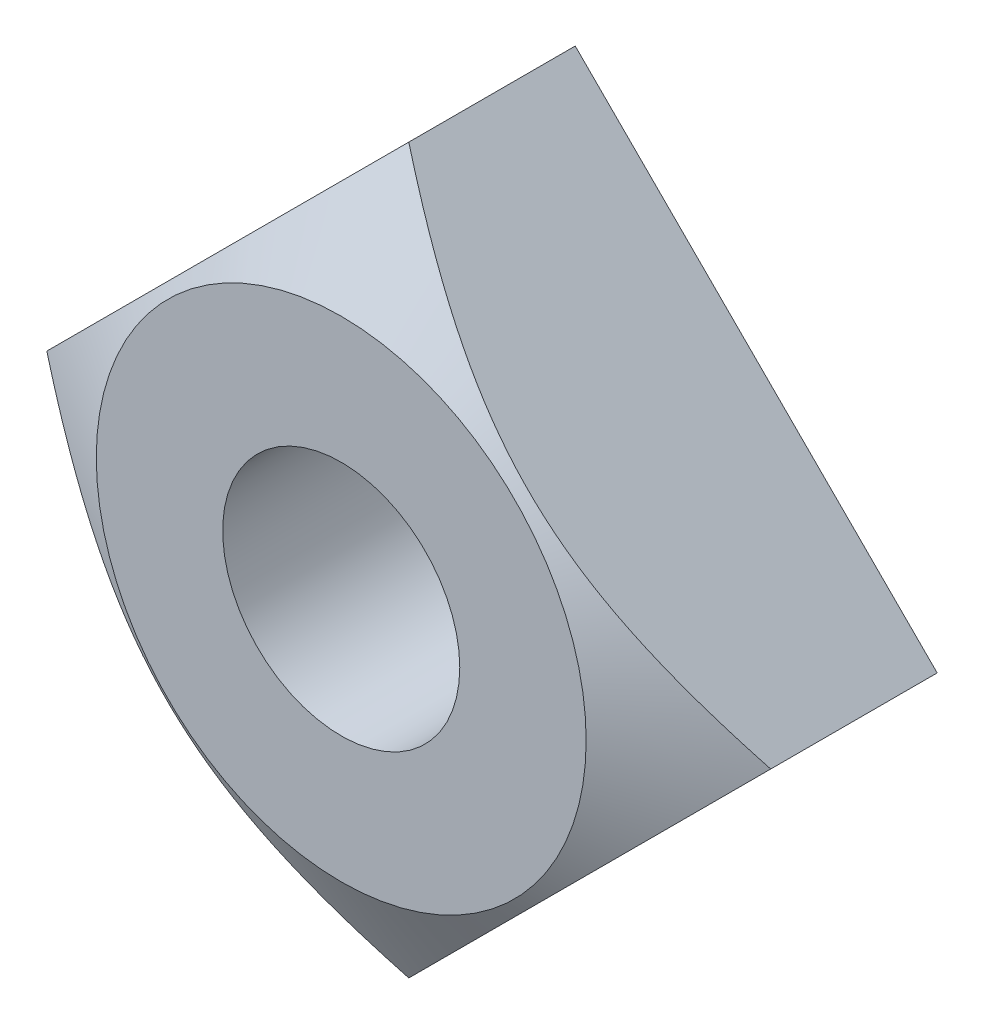
ISO-10303-21;
HEADER;
FILE_DESCRIPTION(('STEP AP214'),'2;1');
FILE_NAME('part.step','',(''),(''),'','','');
FILE_SCHEMA(('AUTOMOTIVE_DESIGN { 1 0 10303 214 1 1 1 1 }'));
ENDSEC;
DATA;
#1=APPLICATION_CONTEXT('core data for automotive mechanical design processes');
#2=APPLICATION_PROTOCOL_DEFINITION('international standard','automotive_design',2000,#1);
#3=PRODUCT_CONTEXT('',#1,'mechanical');
#4=PRODUCT('Part','Part','',(#3));
#5=PRODUCT_RELATED_PRODUCT_CATEGORY('part','',(#4));
#6=PRODUCT_DEFINITION_FORMATION('','',#4);
#7=PRODUCT_DEFINITION_CONTEXT('part definition',#1,'design');
#8=PRODUCT_DEFINITION('design','',#6,#7);
#9=PRODUCT_DEFINITION_SHAPE('','',#8);
#10=(LENGTH_UNIT() NAMED_UNIT(*) SI_UNIT(.MILLI.,.METRE.));
#11=(NAMED_UNIT(*) PLANE_ANGLE_UNIT() SI_UNIT($,.RADIAN.));
#12=(NAMED_UNIT(*) SI_UNIT($,.STERADIAN.) SOLID_ANGLE_UNIT());
#13=UNCERTAINTY_MEASURE_WITH_UNIT(LENGTH_MEASURE(1.E-05),#10,'distance_accuracy_value','');
#14=(GEOMETRIC_REPRESENTATION_CONTEXT(3) GLOBAL_UNCERTAINTY_ASSIGNED_CONTEXT((#13)) GLOBAL_UNIT_ASSIGNED_CONTEXT((#10,
#11,#12)) REPRESENTATION_CONTEXT('',''));
#15=CARTESIAN_POINT('',(0.,0.,0.));
#16=DIRECTION('',(0.,0.,1.));
#17=DIRECTION('',(1.,0.,0.));
#18=AXIS2_PLACEMENT_3D('',#15,#16,#17);
#19=CARTESIAN_POINT('',(-4.94974746830584,0.,-3.2));
#20=DIRECTION('',(-0.707106781186546,-0.707106781186549,0.));
#21=DIRECTION('',(0.707106781186549,-0.707106781186546,0.));
#22=AXIS2_PLACEMENT_3D('',#19,#20,#21);
#23=PLANE('',#22);
#24=DIRECTION('',(0.,0.,1.));
#25=VECTOR('',#24,1.);
#26=CARTESIAN_POINT('',(0.,-4.94974746830582,-3.2));
#27=LINE('',#26,#25);
#28=CARTESIAN_POINT('',(0.,-4.94974746830582,-3.2));
#29=VERTEX_POINT('',#28);
#30=CARTESIAN_POINT('',(0.,-4.94974746830582,-0.923760430703405));
#31=VERTEX_POINT('',#30);
#32=EDGE_CURVE('E41',#29,#31,#27,.T.);
#33=ORIENTED_EDGE('',*,*,#32,.T.);
#34=CARTESIAN_POINT('',(0.000199999999999179,-4.94994746830582,-0.923875903089995));
#35=CARTESIAN_POINT('',(-0.0839601660028808,-4.86578730230294,-0.875301700684418));
#36=CARTESIAN_POINT('',(-0.168424419906984,-4.78132304839884,-0.827756769447801));
#37=CARTESIAN_POINT('',(-0.338079689757784,-4.61166777854804,-0.73521253325769));
#38=CARTESIAN_POINT('',(-0.423270948006075,-4.52647652029975,-0.690214118462973));
#39=CARTESIAN_POINT('',(-0.594968462234951,-4.35477900607087,-0.603016299925455));
#40=CARTESIAN_POINT('',(-0.681479588449488,-4.26826787985634,-0.560835877028449));
#41=CARTESIAN_POINT('',(-0.855358878652713,-4.09438858965311,-0.480244658262813));
#42=CARTESIAN_POINT('',(-0.942726969304584,-4.00702049900124,-0.441833542869514));
#43=CARTESIAN_POINT('',(-1.20330061446436,-3.74644685384146,-0.334596357966231));
#44=CARTESIAN_POINT('',(-1.37791598238263,-3.57183148592319,-0.272223037278309));
#45=CARTESIAN_POINT('',(-1.64222911972484,-3.30751834858099,-0.19698577814739));
#46=CARTESIAN_POINT('',(-1.73063793841792,-3.21910952988791,-0.174973987250971));
#47=CARTESIAN_POINT('',(-1.90818482696287,-3.04156264134296,-0.137862086448636));
#48=CARTESIAN_POINT('',(-1.99732281697572,-2.95242465133011,-0.122761229888339));
#49=CARTESIAN_POINT('',(-2.16148855844019,-2.78825890986564,-0.101990357616201));
#50=CARTESIAN_POINT('',(-2.2364447516216,-2.71330271668424,-0.0951833604501962));
#51=CARTESIAN_POINT('',(-2.38650648576161,-2.56324098254422,-0.0871121078921697));
#52=CARTESIAN_POINT('',(-2.46161202165303,-2.48813544665281,-0.0858476675465542));
#53=CARTESIAN_POINT('',(-2.61179942215488,-2.33794804615095,-0.0889101420700603));
#54=CARTESIAN_POINT('',(-2.68688126145778,-2.26286620684805,-0.0932395392237168));
#55=CARTESIAN_POINT('',(-2.83678422284844,-2.11296324545739,-0.107333399766151));
#56=CARTESIAN_POINT('',(-2.91160534019332,-2.03814212811252,-0.117097961514012));
#57=CARTESIAN_POINT('',(-3.13567456319269,-1.81407290511314,-0.15413062636452));
#58=CARTESIAN_POINT('',(-3.28430015054405,-1.66544731776178,-0.189131487418882));
#59=CARTESIAN_POINT('',(-3.5790206770755,-1.37072679123034,-0.275869415362278));
#60=CARTESIAN_POINT('',(-3.72511502076127,-1.22463244754457,-0.327610365638892));
#61=CARTESIAN_POINT('',(-3.96203126397509,-0.987716204330746,-0.422603609169501));
#62=CARTESIAN_POINT('',(-4.05362686764023,-0.896120600665609,-0.462096846697825));
#63=CARTESIAN_POINT('',(-4.23582321894716,-0.713924249358685,-0.545301855299965));
#64=CARTESIAN_POINT('',(-4.32642425639997,-0.623323211905875,-0.589012359074477));
#65=CARTESIAN_POINT('',(-4.50628300957973,-0.44346445872611,-0.679657577017405));
#66=CARTESIAN_POINT('',(-4.59554524176978,-0.354202226536065,-0.726574515335598));
#67=CARTESIAN_POINT('',(-4.77329907020979,-0.176448398096054,-0.823244540275509));
#68=CARTESIAN_POINT('',(-4.86179067498948,-0.0879567933163678,-0.87299759545944));
#69=CARTESIAN_POINT('',(-4.94994746830582,0.000199999999975448,-0.923875903089995));
#70=B_SPLINE_CURVE_WITH_KNOTS('',3,(#34,#35,#36,#37,#38,#39,#40,#41,#42,#43,#44,#45,#46,#47,#48,
#49,#50,#51,#52,#53,#54,#55,#56,#57,#58,#59,#60,#61,#62,#63,#64,#65,#66,#67,#68,#69),
.UNSPECIFIED.,.F.,.F.,(4,2,2,2,2,2,2,2,2,2,2,2,2,2,2,2,2,4),(0.,0.385660384227343,
0.771454757365617,1.15962924110927,1.54777079077608,2.3107687144879,2.69147048630605,
3.0721311175526,3.39066217819685,3.70918260946644,4.02784443382364,4.34651202512738,
4.98481192887893,5.62326001256813,6.02945619494842,6.43553069227648,6.83951259586986,
7.24349002227529),.UNSPECIFIED.);
#71=CARTESIAN_POINT('',(-4.94974746830582,0.,-0.923760430703405));
#72=VERTEX_POINT('',#71);
#73=EDGE_CURVE('E54',#31,#72,#70,.T.);
#74=ORIENTED_EDGE('',*,*,#73,.T.);
#75=DIRECTION('',(0.,0.,1.));
#76=VECTOR('',#75,1.);
#77=CARTESIAN_POINT('',(-4.94974746830584,0.,-3.2));
#78=LINE('',#77,#76);
#79=CARTESIAN_POINT('',(-4.94974746830584,0.,-3.2));
#80=VERTEX_POINT('',#79);
#81=EDGE_CURVE('E11',#80,#72,#78,.T.);
#82=ORIENTED_EDGE('',*,*,#81,.F.);
#83=DIRECTION('',(0.707106781186549,-0.707106781186546,0.));
#84=VECTOR('',#83,1.);
#85=CARTESIAN_POINT('',(-4.94974746830584,0.,-3.2));
#86=LINE('',#85,#84);
#87=EDGE_CURVE('E107',#80,#29,#86,.T.);
#88=ORIENTED_EDGE('',*,*,#87,.T.);
#89=EDGE_LOOP('',(#33,#74,#82,#88));
#90=FACE_BOUND('',#89,.T.);
#91=ADVANCED_FACE('F37',(#90),#23,.T.);
#92=CARTESIAN_POINT('',(-4.94974746830584,0.,-3.2));
#93=DIRECTION('',(-0.707106781186546,0.707106781186549,0.));
#94=DIRECTION('',(-0.707106781186549,-0.707106781186546,0.));
#95=AXIS2_PLACEMENT_3D('',#92,#93,#94);
#96=PLANE('',#95);
#97=ORIENTED_EDGE('',*,*,#81,.T.);
#98=CARTESIAN_POINT('',(-4.94994746830582,-0.000199999999978556,-0.923875903089996));
#99=CARTESIAN_POINT('',(-4.86578730230294,0.0839601660029008,-0.875301700684419));
#100=CARTESIAN_POINT('',(-4.78132304839884,0.168424419907004,-0.827756769447802));
#101=CARTESIAN_POINT('',(-4.61166777854804,0.338079689757803,-0.73521253325769));
#102=CARTESIAN_POINT('',(-4.52647652029975,0.423270948006094,-0.690214118462972));
#103=CARTESIAN_POINT('',(-4.35477900607087,0.594968462234969,-0.603016299925455));
#104=CARTESIAN_POINT('',(-4.26826787985633,0.681479588449506,-0.560835877028449));
#105=CARTESIAN_POINT('',(-4.09438858965311,0.85535887865273,-0.480244658262813));
#106=CARTESIAN_POINT('',(-4.00702049900124,0.9427269693046,-0.441833542869514));
#107=CARTESIAN_POINT('',(-3.74644685384146,1.20330061446438,-0.334596357966231));
#108=CARTESIAN_POINT('',(-3.57183148592319,1.37791598238265,-0.272223037278309));
#109=CARTESIAN_POINT('',(-3.30751834858098,1.64222911972486,-0.196985778147389));
#110=CARTESIAN_POINT('',(-3.21910952988791,1.73063793841793,-0.174973987250971));
#111=CARTESIAN_POINT('',(-3.04156264134295,1.90818482696288,-0.137862086448636));
#112=CARTESIAN_POINT('',(-2.95242465133011,1.99732281697573,-0.122761229888339));
#113=CARTESIAN_POINT('',(-2.78825890986563,2.1614885584402,-0.101990357616201));
#114=CARTESIAN_POINT('',(-2.71330271668423,2.23644475162161,-0.0951833604501964));
#115=CARTESIAN_POINT('',(-2.56324098254421,2.38650648576162,-0.0871121078921698));
#116=CARTESIAN_POINT('',(-2.4881354466528,2.46161202165304,-0.0858476675465542));
#117=CARTESIAN_POINT('',(-2.33794804615094,2.61179942215489,-0.0889101420700601));
#118=CARTESIAN_POINT('',(-2.26286620684804,2.68688126145779,-0.0932395392237165));
#119=CARTESIAN_POINT('',(-2.11296324545738,2.83678422284845,-0.107333399766151));
#120=CARTESIAN_POINT('',(-2.03814212811251,2.91160534019332,-0.117097961514012));
#121=CARTESIAN_POINT('',(-1.81407290511313,3.1356745631927,-0.15413062636452));
#122=CARTESIAN_POINT('',(-1.66544731776177,3.28430015054406,-0.189131487418882));
#123=CARTESIAN_POINT('',(-1.37072679123033,3.5790206770755,-0.275869415362277));
#124=CARTESIAN_POINT('',(-1.22463244754456,3.72511502076127,-0.327610365638891));
#125=CARTESIAN_POINT('',(-0.987716204330729,3.9620312639751,-0.4226036091695));
#126=CARTESIAN_POINT('',(-0.896120600665592,4.05362686764023,-0.462096846697825));
#127=CARTESIAN_POINT('',(-0.713924249358667,4.23582321894716,-0.545301855299965));
#128=CARTESIAN_POINT('',(-0.623323211905855,4.32642425639997,-0.589012359074476));
#129=CARTESIAN_POINT('',(-0.443464458726088,4.50628300957974,-0.679657577017405));
#130=CARTESIAN_POINT('',(-0.354202226536043,4.59554524176978,-0.726574515335599));
#131=CARTESIAN_POINT('',(-0.176448398096032,4.77329907020979,-0.82324454027551));
#132=CARTESIAN_POINT('',(-0.0879567933163446,4.86179067498948,-0.872997595459441));
#133=CARTESIAN_POINT('',(0.000199999999999686,4.94994746830582,-0.923875903089996));
#134=B_SPLINE_CURVE_WITH_KNOTS('',3,(#98,#99,#100,#101,#102,#103,#104,#105,#106,#107,#108,#109,
#110,#111,#112,#113,#114,#115,#116,#117,#118,#119,#120,#121,#122,#123,#124,#125,#126,#127,#128,
#129,#130,#131,#132,#133),.UNSPECIFIED.,.F.,.F.,(4,2,2,2,2,2,2,2,2,2,2,2,2,2,2,2,2,4),(0.,
0.385660384227344,0.771454757365618,1.15962924110927,1.54777079077608,2.3107687144879,
2.69147048630605,3.0721311175526,3.39066217819685,3.70918260946645,4.02784443382364,
4.34651202512738,4.98481192887893,5.62326001256813,6.02945619494842,6.43553069227649,
6.83951259586986,7.24349002227529),.UNSPECIFIED.);
#135=CARTESIAN_POINT('',(0.,4.94974746830582,-0.923760430703405));
#136=VERTEX_POINT('',#135);
#137=EDGE_CURVE('E93',#72,#136,#134,.T.);
#138=ORIENTED_EDGE('',*,*,#137,.T.);
#139=DIRECTION('',(0.,0.,1.));
#140=VECTOR('',#139,1.);
#141=CARTESIAN_POINT('',(0.,4.94974746830582,-3.2));
#142=LINE('',#141,#140);
#143=CARTESIAN_POINT('',(0.,4.94974746830582,-3.2));
#144=VERTEX_POINT('',#143);
#145=EDGE_CURVE('E46',#144,#136,#142,.T.);
#146=ORIENTED_EDGE('',*,*,#145,.F.);
#147=DIRECTION('',(-0.707106781186549,-0.707106781186546,0.));
#148=VECTOR('',#147,1.);
#149=CARTESIAN_POINT('',(-4.94974746830584,0.,-3.2));
#150=LINE('',#149,#148);
#151=EDGE_CURVE('E100',#144,#80,#150,.T.);
#152=ORIENTED_EDGE('',*,*,#151,.T.);
#153=EDGE_LOOP('',(#97,#138,#146,#152));
#154=FACE_BOUND('',#153,.T.);
#155=ADVANCED_FACE('F146',(#154),#96,.T.);
#156=CARTESIAN_POINT('',(4.94974746830584,0.,-3.2));
#157=DIRECTION('',(0.707106781186546,0.707106781186549,0.));
#158=DIRECTION('',(-0.707106781186549,0.707106781186546,0.));
#159=AXIS2_PLACEMENT_3D('',#156,#157,#158);
#160=PLANE('',#159);
#161=ORIENTED_EDGE('',*,*,#145,.T.);
#162=CARTESIAN_POINT('',(-0.000200000000000852,4.94994746830582,-0.923875903089995));
#163=CARTESIAN_POINT('',(0.0839601660028781,4.86578730230294,-0.875301700684418));
#164=CARTESIAN_POINT('',(0.168424419906982,4.78132304839884,-0.827756769447801));
#165=CARTESIAN_POINT('',(0.338079689757783,4.61166777854804,-0.735212533257689));
#166=CARTESIAN_POINT('',(0.423270948006074,4.52647652029975,-0.690214118462972));
#167=CARTESIAN_POINT('',(0.59496846223495,4.35477900607087,-0.603016299925455));
#168=CARTESIAN_POINT('',(0.681479588449486,4.26826787985634,-0.560835877028449));
#169=CARTESIAN_POINT('',(0.85535887865271,4.09438858965311,-0.480244658262813));
#170=CARTESIAN_POINT('',(0.942726969304582,4.00702049900124,-0.441833542869513));
#171=CARTESIAN_POINT('',(1.20330061446436,3.74644685384146,-0.334596357966231));
#172=CARTESIAN_POINT('',(1.37791598238263,3.57183148592319,-0.272223037278309));
#173=CARTESIAN_POINT('',(1.64222911972484,3.30751834858099,-0.196985778147389));
#174=CARTESIAN_POINT('',(1.73063793841791,3.21910952988791,-0.174973987250971));
#175=CARTESIAN_POINT('',(1.90818482696287,3.04156264134296,-0.137862086448636));
#176=CARTESIAN_POINT('',(1.99732281697572,2.95242465133011,-0.122761229888339));
#177=CARTESIAN_POINT('',(2.16148855844019,2.78825890986564,-0.101990357616201));
#178=CARTESIAN_POINT('',(2.23644475162159,2.71330271668424,-0.0951833604501959));
#179=CARTESIAN_POINT('',(2.38650648576161,2.56324098254422,-0.0871121078921692));
#180=CARTESIAN_POINT('',(2.46161202165302,2.48813544665281,-0.0858476675465535));
#181=CARTESIAN_POINT('',(2.61179942215488,2.33794804615095,-0.0889101420700595));
#182=CARTESIAN_POINT('',(2.68688126145778,2.26286620684805,-0.0932395392237159));
#183=CARTESIAN_POINT('',(2.83678422284844,2.11296324545739,-0.10733339976615));
#184=CARTESIAN_POINT('',(2.91160534019331,2.03814212811252,-0.117097961514011));
#185=CARTESIAN_POINT('',(3.13567456319269,1.81407290511315,-0.154130626364519));
#186=CARTESIAN_POINT('',(3.28430015054405,1.66544731776178,-0.189131487418881));
#187=CARTESIAN_POINT('',(3.57902067707549,1.37072679123034,-0.275869415362276));
#188=CARTESIAN_POINT('',(3.72511502076127,1.22463244754457,-0.327610365638891));
#189=CARTESIAN_POINT('',(3.96203126397509,0.987716204330747,-0.422603609169499));
#190=CARTESIAN_POINT('',(4.05362686764023,0.89612060066561,-0.462096846697824));
#191=CARTESIAN_POINT('',(4.23582321894715,0.713924249358685,-0.545301855299964));
#192=CARTESIAN_POINT('',(4.32642425639997,0.623323211905875,-0.589012359074475));
#193=CARTESIAN_POINT('',(4.50628300957973,0.443464458726109,-0.679657577017404));
#194=CARTESIAN_POINT('',(4.59554524176978,0.354202226536064,-0.726574515335598));
#195=CARTESIAN_POINT('',(4.77329907020979,0.176448398096053,-0.823244540275509));
#196=CARTESIAN_POINT('',(4.86179067498948,0.0879567933163666,-0.872997595459441));
#197=CARTESIAN_POINT('',(4.94994746830582,-0.000199999999976861,-0.923875903089995));
#198=B_SPLINE_CURVE_WITH_KNOTS('',3,(#162,#163,#164,#165,#166,#167,#168,#169,#170,#171,#172,
#173,#174,#175,#176,#177,#178,#179,#180,#181,#182,#183,#184,#185,#186,#187,#188,#189,#190,#191,
#192,#193,#194,#195,#196,#197),.UNSPECIFIED.,.F.,.F.,(4,2,2,2,2,2,2,2,2,2,2,2,2,2,2,2,2,4),(0.,
0.385660384227344,0.771454757365618,1.15962924110927,1.54777079077608,2.3107687144879,
2.69147048630605,3.0721311175526,3.39066217819685,3.70918260946644,4.02784443382363,
4.34651202512738,4.98481192887893,5.62326001256813,6.02945619494842,6.43553069227649,
6.83951259586986,7.24349002227529),.UNSPECIFIED.);
#199=CARTESIAN_POINT('',(4.94974746830582,0.,-0.923760430703405));
#200=VERTEX_POINT('',#199);
#201=EDGE_CURVE('E80',#136,#200,#198,.T.);
#202=ORIENTED_EDGE('',*,*,#201,.T.);
#203=DIRECTION('',(0.,0.,1.));
#204=VECTOR('',#203,1.);
#205=CARTESIAN_POINT('',(4.94974746830584,0.,-3.2));
#206=LINE('',#205,#204);
#207=CARTESIAN_POINT('',(4.94974746830584,0.,-3.2));
#208=VERTEX_POINT('',#207);
#209=EDGE_CURVE('E91',#208,#200,#206,.T.);
#210=ORIENTED_EDGE('',*,*,#209,.F.);
#211=DIRECTION('',(-0.707106781186549,0.707106781186546,0.));
#212=VECTOR('',#211,1.);
#213=CARTESIAN_POINT('',(4.94974746830584,0.,-3.2));
#214=LINE('',#213,#212);
#215=EDGE_CURVE('E104',#208,#144,#214,.T.);
#216=ORIENTED_EDGE('',*,*,#215,.T.);
#217=EDGE_LOOP('',(#161,#202,#210,#216));
#218=FACE_BOUND('',#217,.T.);
#219=ADVANCED_FACE('F89',(#218),#160,.T.);
#220=CARTESIAN_POINT('',(4.94974746830584,0.,-3.2));
#221=DIRECTION('',(0.707106781186546,-0.707106781186549,0.));
#222=DIRECTION('',(0.707106781186549,0.707106781186546,0.));
#223=AXIS2_PLACEMENT_3D('',#220,#221,#222);
#224=PLANE('',#223);
#225=ORIENTED_EDGE('',*,*,#209,.T.);
#226=CARTESIAN_POINT('',(4.94994746830582,0.000199999999977127,-0.923875903089996));
#227=CARTESIAN_POINT('',(4.86578730230294,-0.0839601660029019,-0.875301700684419));
#228=CARTESIAN_POINT('',(4.78132304839884,-0.168424419907005,-0.827756769447802));
#229=CARTESIAN_POINT('',(4.61166777854804,-0.338079689757805,-0.73521253325769));
#230=CARTESIAN_POINT('',(4.52647652029975,-0.423270948006095,-0.690214118462972));
#231=CARTESIAN_POINT('',(4.35477900607087,-0.59496846223497,-0.603016299925455));
#232=CARTESIAN_POINT('',(4.26826787985633,-0.681479588449506,-0.560835877028449));
#233=CARTESIAN_POINT('',(4.09438858965311,-0.85535887865273,-0.480244658262813));
#234=CARTESIAN_POINT('',(4.00702049900124,-0.942726969304601,-0.441833542869514));
#235=CARTESIAN_POINT('',(3.74644685384146,-1.20330061446438,-0.334596357966231));
#236=CARTESIAN_POINT('',(3.57183148592319,-1.37791598238265,-0.272223037278309));
#237=CARTESIAN_POINT('',(3.30751834858098,-1.64222911972486,-0.196985778147389));
#238=CARTESIAN_POINT('',(3.21910952988791,-1.73063793841793,-0.174973987250971));
#239=CARTESIAN_POINT('',(3.04156264134295,-1.90818482696288,-0.137862086448636));
#240=CARTESIAN_POINT('',(2.9524246513301,-1.99732281697573,-0.122761229888339));
#241=CARTESIAN_POINT('',(2.78825890986563,-2.1614885584402,-0.101990357616201));
#242=CARTESIAN_POINT('',(2.71330271668423,-2.23644475162161,-0.0951833604501961));
#243=CARTESIAN_POINT('',(2.56324098254421,-2.38650648576162,-0.0871121078921693));
#244=CARTESIAN_POINT('',(2.4881354466528,-2.46161202165304,-0.0858476675465534));
#245=CARTESIAN_POINT('',(2.33794804615094,-2.61179942215489,-0.0889101420700593));
#246=CARTESIAN_POINT('',(2.26286620684804,-2.68688126145779,-0.0932395392237158));
#247=CARTESIAN_POINT('',(2.11296324545738,-2.83678422284845,-0.10733339976615));
#248=CARTESIAN_POINT('',(2.03814212811251,-2.91160534019332,-0.117097961514011));
#249=CARTESIAN_POINT('',(1.81407290511313,-3.1356745631927,-0.154130626364519));
#250=CARTESIAN_POINT('',(1.66544731776177,-3.28430015054406,-0.189131487418881));
#251=CARTESIAN_POINT('',(1.37072679123033,-3.5790206770755,-0.275869415362276));
#252=CARTESIAN_POINT('',(1.22463244754456,-3.72511502076127,-0.327610365638891));
#253=CARTESIAN_POINT('',(0.987716204330729,-3.9620312639751,-0.422603609169499));
#254=CARTESIAN_POINT('',(0.896120600665591,-4.05362686764023,-0.462096846697824));
#255=CARTESIAN_POINT('',(0.713924249358666,-4.23582321894716,-0.545301855299964));
#256=CARTESIAN_POINT('',(0.623323211905855,-4.32642425639997,-0.589012359074475));
#257=CARTESIAN_POINT('',(0.443464458726088,-4.50628300957973,-0.679657577017404));
#258=CARTESIAN_POINT('',(0.354202226536042,-4.59554524176978,-0.726574515335598));
#259=CARTESIAN_POINT('',(0.17644839809603,-4.77329907020979,-0.823244540275509));
#260=CARTESIAN_POINT('',(0.0879567933163431,-4.86179067498948,-0.87299759545944));
#261=CARTESIAN_POINT('',(-0.000200000000000527,-4.94994746830582,-0.923875903089995));
#262=B_SPLINE_CURVE_WITH_KNOTS('',3,(#226,#227,#228,#229,#230,#231,#232,#233,#234,#235,#236,
#237,#238,#239,#240,#241,#242,#243,#244,#245,#246,#247,#248,#249,#250,#251,#252,#253,#254,#255,
#256,#257,#258,#259,#260,#261),.UNSPECIFIED.,.F.,.F.,(4,2,2,2,2,2,2,2,2,2,2,2,2,2,2,2,2,4),(0.,
0.385660384227344,0.771454757365618,1.15962924110927,1.54777079077608,2.3107687144879,
2.69147048630605,3.0721311175526,3.39066217819685,3.70918260946644,4.02784443382364,
4.34651202512738,4.98481192887893,5.62326001256813,6.02945619494842,6.43553069227648,
6.83951259586986,7.24349002227529),.UNSPECIFIED.);
#263=EDGE_CURVE('E76',#200,#31,#262,.T.);
#264=ORIENTED_EDGE('',*,*,#263,.T.);
#265=ORIENTED_EDGE('',*,*,#32,.F.);
#266=DIRECTION('',(0.707106781186549,0.707106781186546,0.));
#267=VECTOR('',#266,1.);
#268=CARTESIAN_POINT('',(4.94974746830584,0.,-3.2));
#269=LINE('',#268,#267);
#270=EDGE_CURVE('E98',#29,#208,#269,.T.);
#271=ORIENTED_EDGE('',*,*,#270,.T.);
#272=EDGE_LOOP('',(#225,#264,#265,#271));
#273=FACE_BOUND('',#272,.T.);
#274=ADVANCED_FACE('F96',(#273),#224,.T.);
#275=CARTESIAN_POINT('',(0.,-4.94974746830582,0.));
#276=DIRECTION('',(0.,0.,-1.));
#277=DIRECTION('',(-1.,0.,0.));
#278=AXIS2_PLACEMENT_3D('',#275,#276,#277);
#279=PLANE('',#278);
#280=CARTESIAN_POINT('',(0.,0.,0.));
#281=DIRECTION('',(0.,0.,1.));
#282=DIRECTION('',(1.,0.,0.));
#283=AXIS2_PLACEMENT_3D('',#280,#281,#282);
#284=CIRCLE('',#283,1.621125);
#285=CARTESIAN_POINT('',(1.621125,0.,0.));
#286=VERTEX_POINT('',#285);
#287=EDGE_CURVE('E110',#286,#286,#284,.T.);
#288=ORIENTED_EDGE('',*,*,#287,.F.);
#289=EDGE_LOOP('',(#288));
#290=FACE_BOUND('',#289,.T.);
#291=CARTESIAN_POINT('',(0.,0.,0.));
#292=DIRECTION('',(0.,0.,1.));
#293=DIRECTION('',(0.,-1.,0.));
#294=AXIS2_PLACEMENT_3D('',#291,#292,#293);
#295=CIRCLE('',#294,3.34974746830582);
#296=CARTESIAN_POINT('',(0.,-3.34974746830582,0.));
#297=VERTEX_POINT('',#296);
#298=EDGE_CURVE('E85',#297,#297,#295,.T.);
#299=ORIENTED_EDGE('',*,*,#298,.T.);
#300=EDGE_LOOP('',(#299));
#301=FACE_BOUND('',#300,.T.);
#302=ADVANCED_FACE('F151',(#290,#301),#279,.F.);
#303=CARTESIAN_POINT('',(0.,-4.94974746830582,-3.2));
#304=DIRECTION('',(0.,0.,-1.));
#305=DIRECTION('',(-1.,0.,0.));
#306=AXIS2_PLACEMENT_3D('',#303,#304,#305);
#307=PLANE('',#306);
#308=CARTESIAN_POINT('',(0.,0.,-3.2));
#309=DIRECTION('',(0.,0.,1.));
#310=DIRECTION('',(1.,0.,0.));
#311=AXIS2_PLACEMENT_3D('',#308,#309,#310);
#312=CIRCLE('',#311,1.621125);
#313=CARTESIAN_POINT('',(1.621125,0.,-3.2));
#314=VERTEX_POINT('',#313);
#315=EDGE_CURVE('E109',#314,#314,#312,.T.);
#316=ORIENTED_EDGE('',*,*,#315,.T.);
#317=EDGE_LOOP('',(#316));
#318=FACE_BOUND('',#317,.T.);
#319=ORIENTED_EDGE('',*,*,#87,.F.);
#320=ORIENTED_EDGE('',*,*,#151,.F.);
#321=ORIENTED_EDGE('',*,*,#215,.F.);
#322=ORIENTED_EDGE('',*,*,#270,.F.);
#323=EDGE_LOOP('',(#319,#320,#321,#322));
#324=FACE_BOUND('',#323,.T.);
#325=ADVANCED_FACE('F155',(#318,#324),#307,.T.);
#326=CARTESIAN_POINT('',(0.,0.,-3.2));
#327=DIRECTION('',(0.,0.,1.));
#328=DIRECTION('',(1.,0.,0.));
#329=AXIS2_PLACEMENT_3D('',#326,#327,#328);
#330=CYLINDRICAL_SURFACE('',#329,1.621125);
#331=ORIENTED_EDGE('',*,*,#315,.F.);
#332=EDGE_LOOP('',(#331));
#333=FACE_BOUND('',#332,.T.);
#334=ORIENTED_EDGE('',*,*,#287,.T.);
#335=EDGE_LOOP('',(#334));
#336=FACE_BOUND('',#335,.T.);
#337=ADVANCED_FACE('F129',(#333,#336),#330,.F.);
#338=CARTESIAN_POINT('',(0.,0.,0.));
#339=DIRECTION('',(0.,0.,-1.));
#340=DIRECTION('',(0.,1.,0.));
#341=AXIS2_PLACEMENT_3D('',#338,#339,#340);
#342=CONICAL_SURFACE('',#341,3.34974746830582,1.0471975511966);
#343=ORIENTED_EDGE('',*,*,#263,.F.);
#344=ORIENTED_EDGE('',*,*,#201,.F.);
#345=ORIENTED_EDGE('',*,*,#137,.F.);
#346=ORIENTED_EDGE('',*,*,#73,.F.);
#347=EDGE_LOOP('',(#343,#344,#345,#346));
#348=FACE_BOUND('',#347,.T.);
#349=ORIENTED_EDGE('',*,*,#298,.F.);
#350=EDGE_LOOP('',(#349));
#351=FACE_BOUND('',#350,.T.);
#352=ADVANCED_FACE('F78',(#348,#351),#342,.T.);
#353=CLOSED_SHELL('',(#91,#155,#219,#274,#302,#325,#337,#352));
#354=MANIFOLD_SOLID_BREP('B2',#353);
#355=ADVANCED_BREP_SHAPE_REPRESENTATION('',(#18,#354),#14);
#356=SHAPE_DEFINITION_REPRESENTATION(#9,#355);
ENDSEC;
END-ISO-10303-21;
